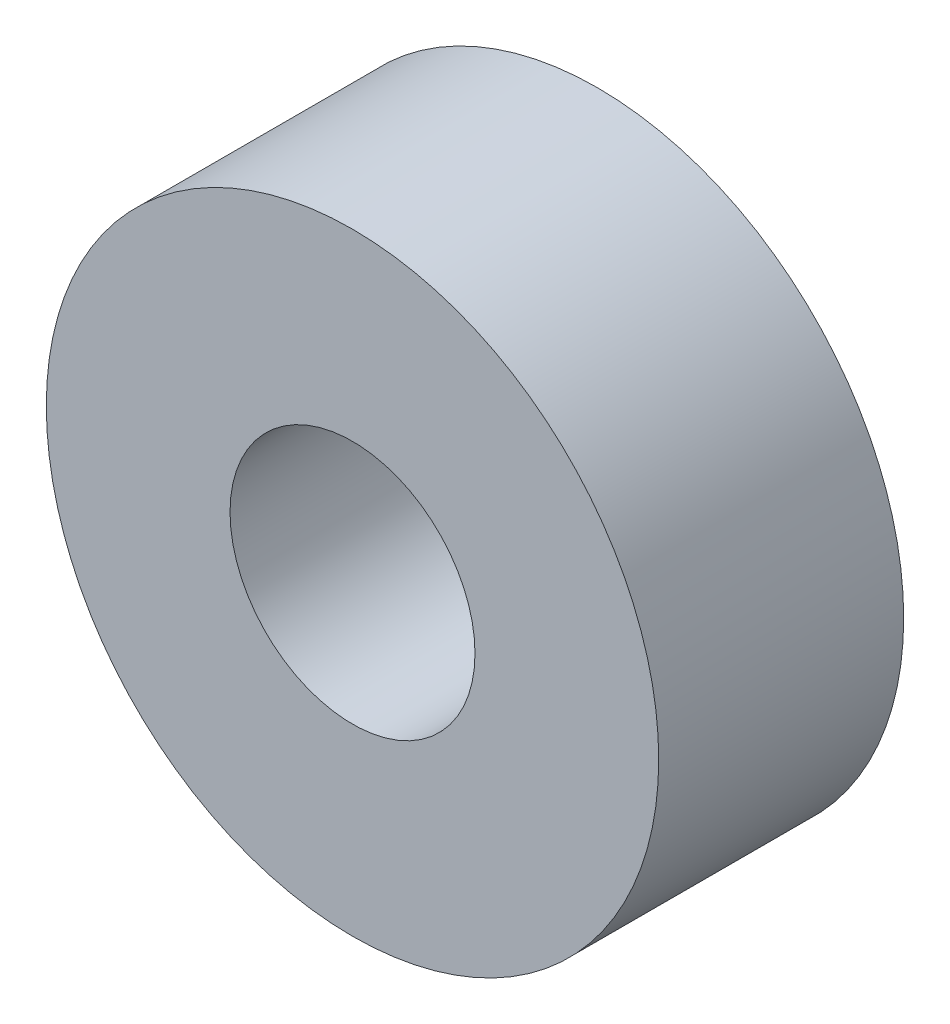
ISO-10303-21;
HEADER;
FILE_DESCRIPTION(('STEP AP214'),'2;1');
FILE_NAME('part.step','',(''),(''),'','','');
FILE_SCHEMA(('AUTOMOTIVE_DESIGN { 1 0 10303 214 1 1 1 1 }'));
ENDSEC;
DATA;
#1=APPLICATION_CONTEXT('core data for automotive mechanical design processes');
#2=APPLICATION_PROTOCOL_DEFINITION('international standard','automotive_design',2000,#1);
#3=PRODUCT_CONTEXT('',#1,'mechanical');
#4=PRODUCT('Part','Part','',(#3));
#5=PRODUCT_RELATED_PRODUCT_CATEGORY('part','',(#4));
#6=PRODUCT_DEFINITION_FORMATION('','',#4);
#7=PRODUCT_DEFINITION_CONTEXT('part definition',#1,'design');
#8=PRODUCT_DEFINITION('design','',#6,#7);
#9=PRODUCT_DEFINITION_SHAPE('','',#8);
#10=(LENGTH_UNIT() NAMED_UNIT(*) SI_UNIT(.MILLI.,.METRE.));
#11=(NAMED_UNIT(*) PLANE_ANGLE_UNIT() SI_UNIT($,.RADIAN.));
#12=(NAMED_UNIT(*) SI_UNIT($,.STERADIAN.) SOLID_ANGLE_UNIT());
#13=UNCERTAINTY_MEASURE_WITH_UNIT(LENGTH_MEASURE(1.E-05),#10,'distance_accuracy_value','');
#14=(GEOMETRIC_REPRESENTATION_CONTEXT(3) GLOBAL_UNCERTAINTY_ASSIGNED_CONTEXT((#13)) GLOBAL_UNIT_ASSIGNED_CONTEXT((#10,
#11,#12)) REPRESENTATION_CONTEXT('',''));
#15=CARTESIAN_POINT('',(0.,0.,0.));
#16=DIRECTION('',(0.,0.,1.));
#17=DIRECTION('',(1.,0.,0.));
#18=AXIS2_PLACEMENT_3D('',#15,#16,#17);
#19=CARTESIAN_POINT('',(0.,0.,2.));
#20=DIRECTION('',(0.,0.,1.));
#21=DIRECTION('',(1.,0.,0.));
#22=AXIS2_PLACEMENT_3D('',#19,#20,#21);
#23=PLANE('',#22);
#24=CARTESIAN_POINT('',(0.,0.,2.));
#25=DIRECTION('',(0.,0.,1.));
#26=DIRECTION('',(1.,0.,0.));
#27=AXIS2_PLACEMENT_3D('',#24,#25,#26);
#28=CIRCLE('',#27,2.5);
#29=CARTESIAN_POINT('',(2.5,0.,2.));
#30=VERTEX_POINT('',#29);
#31=EDGE_CURVE('E10',#30,#30,#28,.T.);
#32=ORIENTED_EDGE('',*,*,#31,.T.);
#33=EDGE_LOOP('',(#32));
#34=FACE_BOUND('',#33,.T.);
#35=CARTESIAN_POINT('',(0.,0.,2.));
#36=DIRECTION('',(0.,0.,1.));
#37=DIRECTION('',(1.,0.,0.));
#38=AXIS2_PLACEMENT_3D('',#35,#36,#37);
#39=CIRCLE('',#38,1.);
#40=CARTESIAN_POINT('',(1.,0.,2.));
#41=VERTEX_POINT('',#40);
#42=EDGE_CURVE('E46',#41,#41,#39,.T.);
#43=ORIENTED_EDGE('',*,*,#42,.F.);
#44=EDGE_LOOP('',(#43));
#45=FACE_BOUND('',#44,.T.);
#46=ADVANCED_FACE('F35',(#34,#45),#23,.T.);
#47=CARTESIAN_POINT('',(0.,0.,0.));
#48=DIRECTION('',(0.,0.,1.));
#49=DIRECTION('',(1.,0.,0.));
#50=AXIS2_PLACEMENT_3D('',#47,#48,#49);
#51=PLANE('',#50);
#52=CARTESIAN_POINT('',(0.,0.,0.));
#53=DIRECTION('',(0.,0.,1.));
#54=DIRECTION('',(1.,0.,0.));
#55=AXIS2_PLACEMENT_3D('',#52,#53,#54);
#56=CIRCLE('',#55,2.5);
#57=CARTESIAN_POINT('',(2.5,0.,0.));
#58=VERTEX_POINT('',#57);
#59=EDGE_CURVE('E39',#58,#58,#56,.T.);
#60=ORIENTED_EDGE('',*,*,#59,.F.);
#61=EDGE_LOOP('',(#60));
#62=FACE_BOUND('',#61,.T.);
#63=CARTESIAN_POINT('',(0.,0.,0.));
#64=DIRECTION('',(0.,0.,1.));
#65=DIRECTION('',(1.,0.,0.));
#66=AXIS2_PLACEMENT_3D('',#63,#64,#65);
#67=CIRCLE('',#66,1.);
#68=CARTESIAN_POINT('',(1.,0.,0.));
#69=VERTEX_POINT('',#68);
#70=EDGE_CURVE('E48',#69,#69,#67,.T.);
#71=ORIENTED_EDGE('',*,*,#70,.T.);
#72=EDGE_LOOP('',(#71));
#73=FACE_BOUND('',#72,.T.);
#74=ADVANCED_FACE('F58',(#62,#73),#51,.F.);
#75=CARTESIAN_POINT('',(0.,0.,2.));
#76=DIRECTION('',(0.,0.,-1.));
#77=DIRECTION('',(-1.,0.,0.));
#78=AXIS2_PLACEMENT_3D('',#75,#76,#77);
#79=CYLINDRICAL_SURFACE('',#78,2.5);
#80=ORIENTED_EDGE('',*,*,#31,.F.);
#81=EDGE_LOOP('',(#80));
#82=FACE_BOUND('',#81,.T.);
#83=ORIENTED_EDGE('',*,*,#59,.T.);
#84=EDGE_LOOP('',(#83));
#85=FACE_BOUND('',#84,.T.);
#86=ADVANCED_FACE('F37',(#82,#85),#79,.T.);
#87=CARTESIAN_POINT('',(0.,0.,2.));
#88=DIRECTION('',(0.,0.,-1.));
#89=DIRECTION('',(-1.,0.,0.));
#90=AXIS2_PLACEMENT_3D('',#87,#88,#89);
#91=CYLINDRICAL_SURFACE('',#90,1.);
#92=ORIENTED_EDGE('',*,*,#42,.T.);
#93=EDGE_LOOP('',(#92));
#94=FACE_BOUND('',#93,.T.);
#95=ORIENTED_EDGE('',*,*,#70,.F.);
#96=EDGE_LOOP('',(#95));
#97=FACE_BOUND('',#96,.T.);
#98=ADVANCED_FACE('F54',(#94,#97),#91,.F.);
#99=CLOSED_SHELL('',(#46,#74,#86,#98));
#100=MANIFOLD_SOLID_BREP('B2',#99);
#101=ADVANCED_BREP_SHAPE_REPRESENTATION('',(#18,#100),#14);
#102=SHAPE_DEFINITION_REPRESENTATION(#9,#101);
ENDSEC;
END-ISO-10303-21;
